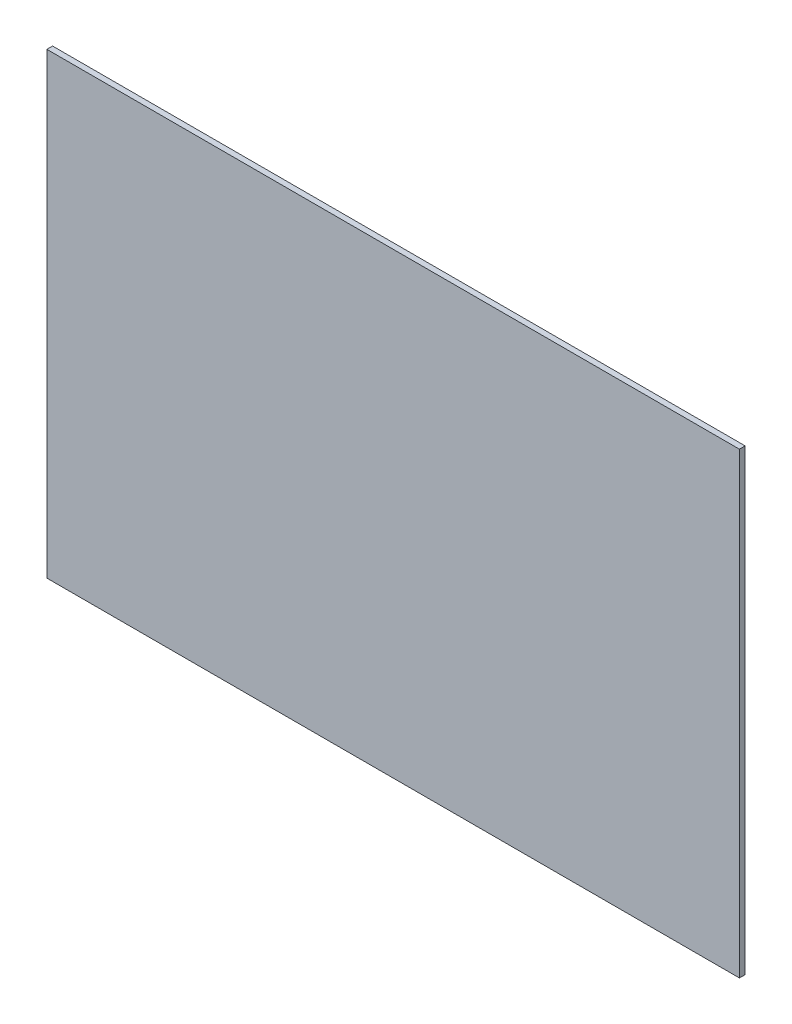
ISO-10303-21;
HEADER;
FILE_DESCRIPTION(('STEP AP214'),'2;1');
FILE_NAME('part.step','',(''),(''),'','','');
FILE_SCHEMA(('AUTOMOTIVE_DESIGN { 1 0 10303 214 1 1 1 1 }'));
ENDSEC;
DATA;
#1=APPLICATION_CONTEXT('core data for automotive mechanical design processes');
#2=APPLICATION_PROTOCOL_DEFINITION('international standard','automotive_design',2000,#1);
#3=PRODUCT_CONTEXT('',#1,'mechanical');
#4=PRODUCT('Part','Part','',(#3));
#5=PRODUCT_RELATED_PRODUCT_CATEGORY('part','',(#4));
#6=PRODUCT_DEFINITION_FORMATION('','',#4);
#7=PRODUCT_DEFINITION_CONTEXT('part definition',#1,'design');
#8=PRODUCT_DEFINITION('design','',#6,#7);
#9=PRODUCT_DEFINITION_SHAPE('','',#8);
#10=(LENGTH_UNIT() NAMED_UNIT(*) SI_UNIT(.MILLI.,.METRE.));
#11=(NAMED_UNIT(*) PLANE_ANGLE_UNIT() SI_UNIT($,.RADIAN.));
#12=(NAMED_UNIT(*) SI_UNIT($,.STERADIAN.) SOLID_ANGLE_UNIT());
#13=UNCERTAINTY_MEASURE_WITH_UNIT(LENGTH_MEASURE(1.E-05),#10,'distance_accuracy_value','');
#14=(GEOMETRIC_REPRESENTATION_CONTEXT(3) GLOBAL_UNCERTAINTY_ASSIGNED_CONTEXT((#13)) GLOBAL_UNIT_ASSIGNED_CONTEXT((#10,
#11,#12)) REPRESENTATION_CONTEXT('',''));
#15=CARTESIAN_POINT('',(0.,0.,0.));
#16=DIRECTION('',(0.,0.,1.));
#17=DIRECTION('',(1.,0.,0.));
#18=AXIS2_PLACEMENT_3D('',#15,#16,#17);
#19=CARTESIAN_POINT('',(302.475,200.,5.));
#20=DIRECTION('',(-1.,0.,0.));
#21=DIRECTION('',(0.,-1.,0.));
#22=AXIS2_PLACEMENT_3D('',#19,#20,#21);
#23=PLANE('',#22);
#24=DIRECTION('',(0.,1.,0.));
#25=VECTOR('',#24,1.);
#26=CARTESIAN_POINT('',(302.475,200.,0.));
#27=LINE('',#26,#25);
#28=CARTESIAN_POINT('',(302.475,-200.,0.));
#29=VERTEX_POINT('',#28);
#30=CARTESIAN_POINT('',(302.475,200.,0.));
#31=VERTEX_POINT('',#30);
#32=EDGE_CURVE('E95',#29,#31,#27,.T.);
#33=ORIENTED_EDGE('',*,*,#32,.T.);
#34=DIRECTION('',(0.,0.,-1.));
#35=VECTOR('',#34,1.);
#36=CARTESIAN_POINT('',(302.475,200.,5.));
#37=LINE('',#36,#35);
#38=CARTESIAN_POINT('',(302.475,200.,5.));
#39=VERTEX_POINT('',#38);
#40=EDGE_CURVE('E11',#39,#31,#37,.T.);
#41=ORIENTED_EDGE('',*,*,#40,.F.);
#42=DIRECTION('',(0.,1.,0.));
#43=VECTOR('',#42,1.);
#44=CARTESIAN_POINT('',(302.475,200.,5.));
#45=LINE('',#44,#43);
#46=CARTESIAN_POINT('',(302.475,-200.,5.));
#47=VERTEX_POINT('',#46);
#48=EDGE_CURVE('E83',#47,#39,#45,.T.);
#49=ORIENTED_EDGE('',*,*,#48,.F.);
#50=DIRECTION('',(0.,0.,-1.));
#51=VECTOR('',#50,1.);
#52=CARTESIAN_POINT('',(302.475,-200.,5.));
#53=LINE('',#52,#51);
#54=EDGE_CURVE('E91',#47,#29,#53,.T.);
#55=ORIENTED_EDGE('',*,*,#54,.T.);
#56=EDGE_LOOP('',(#33,#41,#49,#55));
#57=FACE_BOUND('',#56,.T.);
#58=ADVANCED_FACE('F32',(#57),#23,.F.);
#59=CARTESIAN_POINT('',(-302.475,200.,5.));
#60=DIRECTION('',(0.,-1.,0.));
#61=DIRECTION('',(0.,0.,-1.));
#62=AXIS2_PLACEMENT_3D('',#59,#60,#61);
#63=PLANE('',#62);
#64=DIRECTION('',(-1.,0.,0.));
#65=VECTOR('',#64,1.);
#66=CARTESIAN_POINT('',(-302.475,200.,0.));
#67=LINE('',#66,#65);
#68=CARTESIAN_POINT('',(-302.475,200.,0.));
#69=VERTEX_POINT('',#68);
#70=EDGE_CURVE('E87',#31,#69,#67,.T.);
#71=ORIENTED_EDGE('',*,*,#70,.T.);
#72=DIRECTION('',(0.,0.,-1.));
#73=VECTOR('',#72,1.);
#74=CARTESIAN_POINT('',(-302.475,200.,5.));
#75=LINE('',#74,#73);
#76=CARTESIAN_POINT('',(-302.475,200.,5.));
#77=VERTEX_POINT('',#76);
#78=EDGE_CURVE('E40',#77,#69,#75,.T.);
#79=ORIENTED_EDGE('',*,*,#78,.F.);
#80=DIRECTION('',(-1.,0.,0.));
#81=VECTOR('',#80,1.);
#82=CARTESIAN_POINT('',(-302.475,200.,5.));
#83=LINE('',#82,#81);
#84=EDGE_CURVE('E78',#39,#77,#83,.T.);
#85=ORIENTED_EDGE('',*,*,#84,.F.);
#86=ORIENTED_EDGE('',*,*,#40,.T.);
#87=EDGE_LOOP('',(#71,#79,#85,#86));
#88=FACE_BOUND('',#87,.T.);
#89=ADVANCED_FACE('F86',(#88),#63,.F.);
#90=CARTESIAN_POINT('',(-302.475,200.,5.));
#91=DIRECTION('',(1.,0.,0.));
#92=DIRECTION('',(0.,1.,0.));
#93=AXIS2_PLACEMENT_3D('',#90,#91,#92);
#94=PLANE('',#93);
#95=DIRECTION('',(0.,-1.,0.));
#96=VECTOR('',#95,1.);
#97=CARTESIAN_POINT('',(-302.475,200.,0.));
#98=LINE('',#97,#96);
#99=CARTESIAN_POINT('',(-302.475,-200.,0.));
#100=VERTEX_POINT('',#99);
#101=EDGE_CURVE('E65',#69,#100,#98,.T.);
#102=ORIENTED_EDGE('',*,*,#101,.T.);
#103=DIRECTION('',(0.,0.,-1.));
#104=VECTOR('',#103,1.);
#105=CARTESIAN_POINT('',(-302.475,-200.,5.));
#106=LINE('',#105,#104);
#107=CARTESIAN_POINT('',(-302.475,-200.,5.));
#108=VERTEX_POINT('',#107);
#109=EDGE_CURVE('E88',#108,#100,#106,.T.);
#110=ORIENTED_EDGE('',*,*,#109,.F.);
#111=DIRECTION('',(0.,-1.,0.));
#112=VECTOR('',#111,1.);
#113=CARTESIAN_POINT('',(-302.475,200.,5.));
#114=LINE('',#113,#112);
#115=EDGE_CURVE('E81',#77,#108,#114,.T.);
#116=ORIENTED_EDGE('',*,*,#115,.F.);
#117=ORIENTED_EDGE('',*,*,#78,.T.);
#118=EDGE_LOOP('',(#102,#110,#116,#117));
#119=FACE_BOUND('',#118,.T.);
#120=ADVANCED_FACE('F89',(#119),#94,.F.);
#121=CARTESIAN_POINT('',(-302.475,-200.,5.));
#122=DIRECTION('',(0.,1.,0.));
#123=DIRECTION('',(0.,0.,1.));
#124=AXIS2_PLACEMENT_3D('',#121,#122,#123);
#125=PLANE('',#124);
#126=DIRECTION('',(1.,0.,0.));
#127=VECTOR('',#126,1.);
#128=CARTESIAN_POINT('',(-302.475,-200.,0.));
#129=LINE('',#128,#127);
#130=EDGE_CURVE('E71',#100,#29,#129,.T.);
#131=ORIENTED_EDGE('',*,*,#130,.T.);
#132=ORIENTED_EDGE('',*,*,#54,.F.);
#133=DIRECTION('',(1.,0.,0.));
#134=VECTOR('',#133,1.);
#135=CARTESIAN_POINT('',(-302.475,-200.,5.));
#136=LINE('',#135,#134);
#137=EDGE_CURVE('E48',#108,#47,#136,.T.);
#138=ORIENTED_EDGE('',*,*,#137,.F.);
#139=ORIENTED_EDGE('',*,*,#109,.T.);
#140=EDGE_LOOP('',(#131,#132,#138,#139));
#141=FACE_BOUND('',#140,.T.);
#142=ADVANCED_FACE('F102',(#141),#125,.F.);
#143=CARTESIAN_POINT('',(0.,0.,5.));
#144=DIRECTION('',(0.,0.,1.));
#145=DIRECTION('',(1.,0.,0.));
#146=AXIS2_PLACEMENT_3D('',#143,#144,#145);
#147=PLANE('',#146);
#148=ORIENTED_EDGE('',*,*,#48,.T.);
#149=ORIENTED_EDGE('',*,*,#84,.T.);
#150=ORIENTED_EDGE('',*,*,#115,.T.);
#151=ORIENTED_EDGE('',*,*,#137,.T.);
#152=EDGE_LOOP('',(#148,#149,#150,#151));
#153=FACE_BOUND('',#152,.T.);
#154=ADVANCED_FACE('F79',(#153),#147,.T.);
#155=CARTESIAN_POINT('',(0.,0.,0.));
#156=DIRECTION('',(0.,0.,1.));
#157=DIRECTION('',(1.,0.,0.));
#158=AXIS2_PLACEMENT_3D('',#155,#156,#157);
#159=PLANE('',#158);
#160=ORIENTED_EDGE('',*,*,#32,.F.);
#161=ORIENTED_EDGE('',*,*,#130,.F.);
#162=ORIENTED_EDGE('',*,*,#101,.F.);
#163=ORIENTED_EDGE('',*,*,#70,.F.);
#164=EDGE_LOOP('',(#160,#161,#162,#163));
#165=FACE_BOUND('',#164,.T.);
#166=ADVANCED_FACE('F105',(#165),#159,.F.);
#167=CLOSED_SHELL('',(#58,#89,#120,#142,#154,#166));
#168=MANIFOLD_SOLID_BREP('B2',#167);
#169=ADVANCED_BREP_SHAPE_REPRESENTATION('',(#18,#168),#14);
#170=SHAPE_DEFINITION_REPRESENTATION(#9,#169);
ENDSEC;
END-ISO-10303-21;
